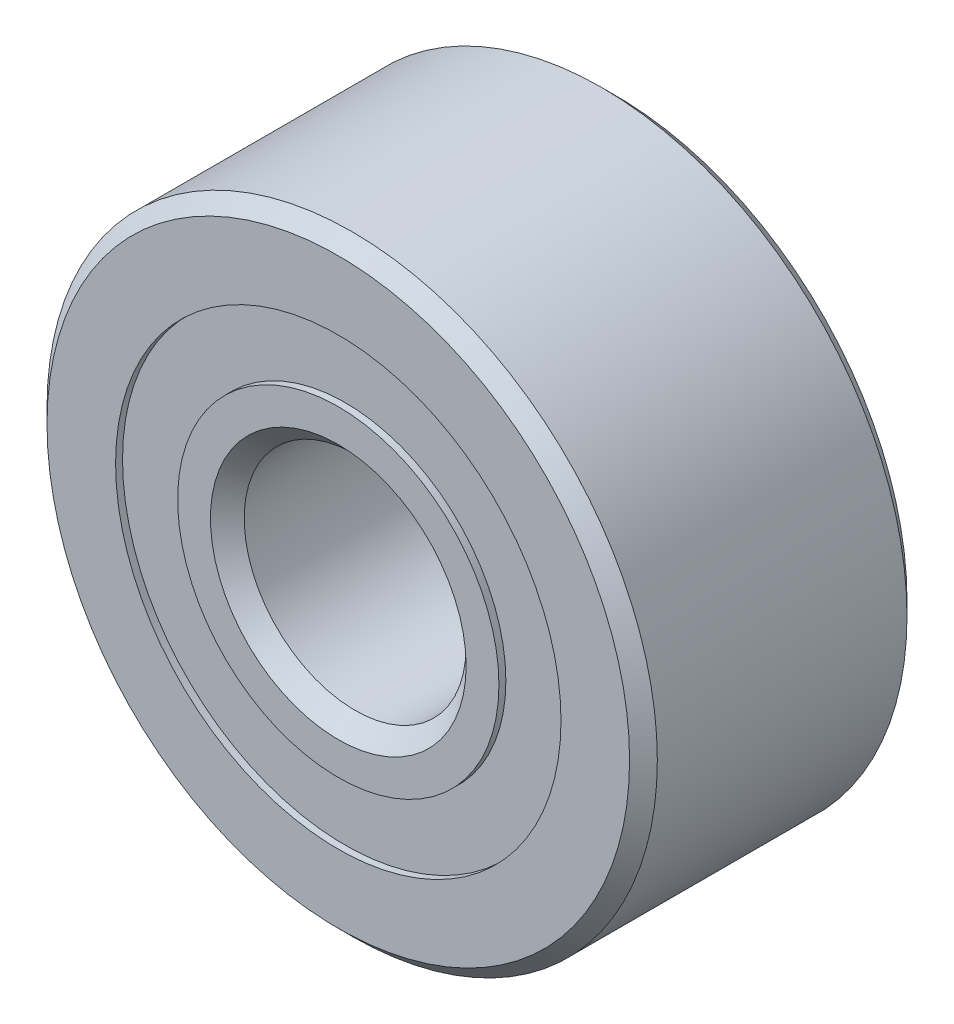
ISO-10303-21;
HEADER;
FILE_DESCRIPTION(('STEP AP214'),'2;1');
FILE_NAME('part.step','',(''),(''),'','','');
FILE_SCHEMA(('AUTOMOTIVE_DESIGN { 1 0 10303 214 1 1 1 1 }'));
ENDSEC;
DATA;
#1=APPLICATION_CONTEXT('core data for automotive mechanical design processes');
#2=APPLICATION_PROTOCOL_DEFINITION('international standard','automotive_design',2000,#1);
#3=PRODUCT_CONTEXT('',#1,'mechanical');
#4=PRODUCT('Part','Part','',(#3));
#5=PRODUCT_RELATED_PRODUCT_CATEGORY('part','',(#4));
#6=PRODUCT_DEFINITION_FORMATION('','',#4);
#7=PRODUCT_DEFINITION_CONTEXT('part definition',#1,'design');
#8=PRODUCT_DEFINITION('design','',#6,#7);
#9=PRODUCT_DEFINITION_SHAPE('','',#8);
#10=(LENGTH_UNIT() NAMED_UNIT(*) SI_UNIT(.MILLI.,.METRE.));
#11=(NAMED_UNIT(*) PLANE_ANGLE_UNIT() SI_UNIT($,.RADIAN.));
#12=(NAMED_UNIT(*) SI_UNIT($,.STERADIAN.) SOLID_ANGLE_UNIT());
#13=UNCERTAINTY_MEASURE_WITH_UNIT(LENGTH_MEASURE(1.E-05),#10,'distance_accuracy_value','');
#14=(GEOMETRIC_REPRESENTATION_CONTEXT(3) GLOBAL_UNCERTAINTY_ASSIGNED_CONTEXT((#13)) GLOBAL_UNIT_ASSIGNED_CONTEXT((#10,
#11,#12)) REPRESENTATION_CONTEXT('',''));
#15=CARTESIAN_POINT('',(0.,0.,0.));
#16=DIRECTION('',(0.,0.,1.));
#17=DIRECTION('',(1.,0.,0.));
#18=AXIS2_PLACEMENT_3D('',#15,#16,#17);
#19=CARTESIAN_POINT('',(0.,6.37180631868132,-3.7703125));
#20=DIRECTION('',(0.,0.,1.));
#21=DIRECTION('',(1.,0.,0.));
#22=AXIS2_PLACEMENT_3D('',#19,#20,#21);
#23=PLANE('',#22);
#24=CARTESIAN_POINT('',(0.,0.,-3.7703125));
#25=DIRECTION('',(0.,0.,1.));
#26=DIRECTION('',(1.,0.,0.));
#27=AXIS2_PLACEMENT_3D('',#24,#25,#26);
#28=CIRCLE('',#27,6.37180631868132);
#29=CARTESIAN_POINT('',(6.37180631868132,0.,-3.7703125));
#30=VERTEX_POINT('',#29);
#31=EDGE_CURVE('E64',#30,#30,#28,.T.);
#32=ORIENTED_EDGE('',*,*,#31,.F.);
#33=EDGE_LOOP('',(#32));
#34=FACE_BOUND('',#33,.T.);
#35=CARTESIAN_POINT('',(0.,0.,-3.7703125));
#36=DIRECTION('',(0.,0.,1.));
#37=DIRECTION('',(1.,0.,0.));
#38=AXIS2_PLACEMENT_3D('',#35,#36,#37);
#39=CIRCLE('',#38,4.59602866646654);
#40=CARTESIAN_POINT('',(4.59602866646654,0.,-3.7703125));
#41=VERTEX_POINT('',#40);
#42=EDGE_CURVE('E11',#41,#41,#39,.T.);
#43=ORIENTED_EDGE('',*,*,#42,.T.);
#44=EDGE_LOOP('',(#43));
#45=FACE_BOUND('',#44,.T.);
#46=ADVANCED_FACE('F50',(#34,#45),#23,.F.);
#47=CARTESIAN_POINT('',(0.,0.,3.96875));
#48=DIRECTION('',(0.,0.,1.));
#49=DIRECTION('',(1.,0.,0.));
#50=AXIS2_PLACEMENT_3D('',#47,#48,#49);
#51=CYLINDRICAL_SURFACE('',#50,4.59602866646654);
#52=ORIENTED_EDGE('',*,*,#42,.F.);
#53=EDGE_LOOP('',(#52));
#54=FACE_BOUND('',#53,.T.);
#55=CARTESIAN_POINT('',(0.,0.,-1.81289769677122));
#56=DIRECTION('',(0.,0.,1.));
#57=DIRECTION('',(1.,0.,0.));
#58=AXIS2_PLACEMENT_3D('',#55,#56,#57);
#59=CIRCLE('',#58,4.59602866646654);
#60=CARTESIAN_POINT('',(4.59602866646654,0.,-1.81289769677122));
#61=VERTEX_POINT('',#60);
#62=EDGE_CURVE('E56',#61,#61,#59,.T.);
#63=ORIENTED_EDGE('',*,*,#62,.T.);
#64=EDGE_LOOP('',(#63));
#65=FACE_BOUND('',#64,.T.);
#66=ADVANCED_FACE('F73',(#54,#65),#51,.F.);
#67=CARTESIAN_POINT('',(0.,6.37180631868132,-1.81289769677122));
#68=DIRECTION('',(0.,0.,-1.));
#69=DIRECTION('',(-1.,0.,0.));
#70=AXIS2_PLACEMENT_3D('',#67,#68,#69);
#71=PLANE('',#70);
#72=ORIENTED_EDGE('',*,*,#62,.F.);
#73=EDGE_LOOP('',(#72));
#74=FACE_BOUND('',#73,.T.);
#75=CARTESIAN_POINT('',(0.,0.,-1.81289769677122));
#76=DIRECTION('',(0.,0.,1.));
#77=DIRECTION('',(1.,0.,0.));
#78=AXIS2_PLACEMENT_3D('',#75,#76,#77);
#79=CIRCLE('',#78,6.37180631868132);
#80=CARTESIAN_POINT('',(6.37180631868132,0.,-1.81289769677122));
#81=VERTEX_POINT('',#80);
#82=EDGE_CURVE('E60',#81,#81,#79,.T.);
#83=ORIENTED_EDGE('',*,*,#82,.T.);
#84=EDGE_LOOP('',(#83));
#85=FACE_BOUND('',#84,.T.);
#86=ADVANCED_FACE('F77',(#74,#85),#71,.F.);
#87=CARTESIAN_POINT('',(0.,0.,3.96875));
#88=DIRECTION('',(0.,0.,1.));
#89=DIRECTION('',(1.,0.,0.));
#90=AXIS2_PLACEMENT_3D('',#87,#88,#89);
#91=CYLINDRICAL_SURFACE('',#90,6.37180631868132);
#92=ORIENTED_EDGE('',*,*,#82,.F.);
#93=EDGE_LOOP('',(#92));
#94=FACE_BOUND('',#93,.T.);
#95=ORIENTED_EDGE('',*,*,#31,.T.);
#96=EDGE_LOOP('',(#95));
#97=FACE_BOUND('',#96,.T.);
#98=ADVANCED_FACE('F70',(#94,#97),#91,.T.);
#99=CLOSED_SHELL('',(#46,#66,#86,#98));
#100=MANIFOLD_SOLID_BREP('B2',#99);
#101=CARTESIAN_POINT('',(0.,6.37180631868132,3.7703125));
#102=DIRECTION('',(0.,0.,-1.));
#103=DIRECTION('',(-1.,0.,0.));
#104=AXIS2_PLACEMENT_3D('',#101,#102,#103);
#105=PLANE('',#104);
#106=CARTESIAN_POINT('',(0.,0.,3.7703125));
#107=DIRECTION('',(0.,0.,1.));
#108=DIRECTION('',(1.,0.,0.));
#109=AXIS2_PLACEMENT_3D('',#106,#107,#108);
#110=CIRCLE('',#109,4.59602866646654);
#111=CARTESIAN_POINT('',(4.59602866646654,0.,3.7703125));
#112=VERTEX_POINT('',#111);
#113=EDGE_CURVE('E49',#112,#112,#110,.T.);
#114=ORIENTED_EDGE('',*,*,#113,.F.);
#115=EDGE_LOOP('',(#114));
#116=FACE_BOUND('',#115,.T.);
#117=CARTESIAN_POINT('',(0.,0.,3.7703125));
#118=DIRECTION('',(0.,0.,1.));
#119=DIRECTION('',(1.,0.,0.));
#120=AXIS2_PLACEMENT_3D('',#117,#118,#119);
#121=CIRCLE('',#120,6.37180631868132);
#122=CARTESIAN_POINT('',(6.37180631868132,0.,3.7703125));
#123=VERTEX_POINT('',#122);
#124=EDGE_CURVE('E124',#123,#123,#121,.T.);
#125=ORIENTED_EDGE('',*,*,#124,.T.);
#126=EDGE_LOOP('',(#125));
#127=FACE_BOUND('',#126,.T.);
#128=ADVANCED_FACE('F110',(#116,#127),#105,.F.);
#129=CARTESIAN_POINT('',(0.,0.,3.96875));
#130=DIRECTION('',(0.,0.,1.));
#131=DIRECTION('',(1.,0.,0.));
#132=AXIS2_PLACEMENT_3D('',#129,#130,#131);
#133=CYLINDRICAL_SURFACE('',#132,4.59602866646654);
#134=CARTESIAN_POINT('',(0.,0.,1.81289769677122));
#135=DIRECTION('',(0.,0.,1.));
#136=DIRECTION('',(1.,0.,0.));
#137=AXIS2_PLACEMENT_3D('',#134,#135,#136);
#138=CIRCLE('',#137,4.59602866646654);
#139=CARTESIAN_POINT('',(4.59602866646654,0.,1.81289769677122));
#140=VERTEX_POINT('',#139);
#141=EDGE_CURVE('E116',#140,#140,#138,.T.);
#142=ORIENTED_EDGE('',*,*,#141,.F.);
#143=EDGE_LOOP('',(#142));
#144=FACE_BOUND('',#143,.T.);
#145=ORIENTED_EDGE('',*,*,#113,.T.);
#146=EDGE_LOOP('',(#145));
#147=FACE_BOUND('',#146,.T.);
#148=ADVANCED_FACE('F139',(#144,#147),#133,.F.);
#149=CARTESIAN_POINT('',(0.,6.37180631868132,1.81289769677122));
#150=DIRECTION('',(0.,0.,1.));
#151=DIRECTION('',(1.,0.,0.));
#152=AXIS2_PLACEMENT_3D('',#149,#150,#151);
#153=PLANE('',#152);
#154=CARTESIAN_POINT('',(0.,0.,1.81289769677122));
#155=DIRECTION('',(0.,0.,1.));
#156=DIRECTION('',(1.,0.,0.));
#157=AXIS2_PLACEMENT_3D('',#154,#155,#156);
#158=CIRCLE('',#157,6.37180631868132);
#159=CARTESIAN_POINT('',(6.37180631868132,0.,1.81289769677122));
#160=VERTEX_POINT('',#159);
#161=EDGE_CURVE('E120',#160,#160,#158,.T.);
#162=ORIENTED_EDGE('',*,*,#161,.F.);
#163=EDGE_LOOP('',(#162));
#164=FACE_BOUND('',#163,.T.);
#165=ORIENTED_EDGE('',*,*,#141,.T.);
#166=EDGE_LOOP('',(#165));
#167=FACE_BOUND('',#166,.T.);
#168=ADVANCED_FACE('F134',(#164,#167),#153,.F.);
#169=CARTESIAN_POINT('',(0.,0.,3.96875));
#170=DIRECTION('',(0.,0.,1.));
#171=DIRECTION('',(1.,0.,0.));
#172=AXIS2_PLACEMENT_3D('',#169,#170,#171);
#173=CYLINDRICAL_SURFACE('',#172,6.37180631868132);
#174=ORIENTED_EDGE('',*,*,#124,.F.);
#175=EDGE_LOOP('',(#174));
#176=FACE_BOUND('',#175,.T.);
#177=ORIENTED_EDGE('',*,*,#161,.T.);
#178=EDGE_LOOP('',(#177));
#179=FACE_BOUND('',#178,.T.);
#180=ADVANCED_FACE('F131',(#176,#179),#173,.T.);
#181=CLOSED_SHELL('',(#128,#148,#168,#180));
#182=MANIFOLD_SOLID_BREP('B6',#181);
#183=CARTESIAN_POINT('',(-4.20949505675111,4.20949505675122,0.));
#184=DIRECTION('',(0.,0.,1.));
#185=DIRECTION('',(-0.707106781186539,0.707106781186556,0.));
#186=AXIS2_PLACEMENT_3D('',#183,#184,#185);
#187=SPHERICAL_SURFACE('',#186,1.81289769677122);
#188=CARTESIAN_POINT('',(-4.20949505675111,4.20949505675122,1.81289769677122));
#189=VERTEX_POINT('',#188);
#190=VERTEX_LOOP('',#189);
#191=FACE_BOUND('',#190,.T.);
#192=ADVANCED_FACE('F192',(#191),#187,.T.);
#193=CLOSED_SHELL('',(#192));
#194=MANIFOLD_SOLID_BREP('B44',#193);
#195=CARTESIAN_POINT('',(-5.953125,0.,0.));
#196=DIRECTION('',(0.,0.,1.));
#197=DIRECTION('',(-1.,0.,0.));
#198=AXIS2_PLACEMENT_3D('',#195,#196,#197);
#199=SPHERICAL_SURFACE('',#198,1.81289769677122);
#200=CARTESIAN_POINT('',(-5.953125,0.,1.81289769677122));
#201=VERTEX_POINT('',#200);
#202=VERTEX_LOOP('',#201);
#203=FACE_BOUND('',#202,.T.);
#204=ADVANCED_FACE('F227',(#203),#199,.T.);
#205=CLOSED_SHELL('',(#204));
#206=MANIFOLD_SOLID_BREP('B106',#205);
#207=CARTESIAN_POINT('',(-4.2094950567512,-4.20949505675113,0.));
#208=DIRECTION('',(0.,0.,1.));
#209=DIRECTION('',(-0.707106781186554,-0.707106781186541,0.));
#210=AXIS2_PLACEMENT_3D('',#207,#208,#209);
#211=SPHERICAL_SURFACE('',#210,1.81289769677122);
#212=CARTESIAN_POINT('',(-4.2094950567512,-4.20949505675113,1.81289769677122));
#213=VERTEX_POINT('',#212);
#214=VERTEX_LOOP('',#213);
#215=FACE_BOUND('',#214,.T.);
#216=ADVANCED_FACE('F262',(#215),#211,.T.);
#217=CLOSED_SHELL('',(#216));
#218=MANIFOLD_SOLID_BREP('B188',#217);
#219=CARTESIAN_POINT('',(0.,-5.953125,0.));
#220=DIRECTION('',(0.,0.,1.));
#221=DIRECTION('',(0.,-1.,0.));
#222=AXIS2_PLACEMENT_3D('',#219,#220,#221);
#223=SPHERICAL_SURFACE('',#222,1.81289769677122);
#224=CARTESIAN_POINT('',(0.,-5.953125,1.81289769677122));
#225=VERTEX_POINT('',#224);
#226=VERTEX_LOOP('',#225);
#227=FACE_BOUND('',#226,.T.);
#228=ADVANCED_FACE('F297',(#227),#223,.T.);
#229=CLOSED_SHELL('',(#228));
#230=MANIFOLD_SOLID_BREP('B223',#229);
#231=CARTESIAN_POINT('',(4.20949505675114,-4.20949505675119,0.));
#232=DIRECTION('',(0.,0.,1.));
#233=DIRECTION('',(0.707106781186544,-0.707106781186551,0.));
#234=AXIS2_PLACEMENT_3D('',#231,#232,#233);
#235=SPHERICAL_SURFACE('',#234,1.81289769677122);
#236=CARTESIAN_POINT('',(4.20949505675114,-4.20949505675119,1.81289769677122));
#237=VERTEX_POINT('',#236);
#238=VERTEX_LOOP('',#237);
#239=FACE_BOUND('',#238,.T.);
#240=ADVANCED_FACE('F332',(#239),#235,.T.);
#241=CLOSED_SHELL('',(#240));
#242=MANIFOLD_SOLID_BREP('B258',#241);
#243=CARTESIAN_POINT('',(5.953125,0.,0.));
#244=DIRECTION('',(0.,0.,1.));
#245=DIRECTION('',(1.,0.,0.));
#246=AXIS2_PLACEMENT_3D('',#243,#244,#245);
#247=SPHERICAL_SURFACE('',#246,1.81289769677122);
#248=CARTESIAN_POINT('',(5.953125,0.,1.81289769677122));
#249=VERTEX_POINT('',#248);
#250=VERTEX_LOOP('',#249);
#251=FACE_BOUND('',#250,.T.);
#252=ADVANCED_FACE('F367',(#251),#247,.T.);
#253=CLOSED_SHELL('',(#252));
#254=MANIFOLD_SOLID_BREP('B293',#253);
#255=CARTESIAN_POINT('',(4.20949505675117,4.20949505675116,0.));
#256=DIRECTION('',(0.,0.,1.));
#257=DIRECTION('',(0.707106781186549,0.707106781186546,0.));
#258=AXIS2_PLACEMENT_3D('',#255,#256,#257);
#259=SPHERICAL_SURFACE('',#258,1.81289769677122);
#260=CARTESIAN_POINT('',(4.20949505675117,4.20949505675116,1.81289769677122));
#261=VERTEX_POINT('',#260);
#262=VERTEX_LOOP('',#261);
#263=FACE_BOUND('',#262,.T.);
#264=ADVANCED_FACE('F402',(#263),#259,.T.);
#265=CLOSED_SHELL('',(#264));
#266=MANIFOLD_SOLID_BREP('B328',#265);
#267=CARTESIAN_POINT('',(0.,5.953125,0.));
#268=DIRECTION('',(0.,0.,1.));
#269=DIRECTION('',(0.,1.,0.));
#270=AXIS2_PLACEMENT_3D('',#267,#268,#269);
#271=SPHERICAL_SURFACE('',#270,1.81289769677122);
#272=CARTESIAN_POINT('',(0.,5.953125,1.81289769677122));
#273=VERTEX_POINT('',#272);
#274=VERTEX_LOOP('',#273);
#275=FACE_BOUND('',#274,.T.);
#276=ADVANCED_FACE('F439',(#275),#271,.T.);
#277=CLOSED_SHELL('',(#276));
#278=MANIFOLD_SOLID_BREP('B363',#277);
#279=CARTESIAN_POINT('',(0.,0.,3.96875));
#280=DIRECTION('',(0.,0.,1.));
#281=DIRECTION('',(1.,0.,0.));
#282=AXIS2_PLACEMENT_3D('',#279,#280,#281);
#283=CYLINDRICAL_SURFACE('',#282,4.59602866646654);
#284=CARTESIAN_POINT('',(0.,0.,3.96875));
#285=DIRECTION('',(0.,0.,1.));
#286=DIRECTION('',(1.,0.,0.));
#287=AXIS2_PLACEMENT_3D('',#284,#285,#286);
#288=CIRCLE('',#287,4.59602866646654);
#289=CARTESIAN_POINT('',(4.59602866646654,0.,3.96875));
#290=VERTEX_POINT('',#289);
#291=EDGE_CURVE('E497',#290,#290,#288,.T.);
#292=ORIENTED_EDGE('',*,*,#291,.F.);
#293=EDGE_LOOP('',(#292));
#294=FACE_BOUND('',#293,.T.);
#295=CARTESIAN_POINT('',(0.,0.,3.7703125));
#296=DIRECTION('',(0.,0.,1.));
#297=DIRECTION('',(1.,0.,0.));
#298=AXIS2_PLACEMENT_3D('',#295,#296,#297);
#299=CIRCLE('',#298,4.59602866646654);
#300=CARTESIAN_POINT('',(4.59602866646654,0.,3.7703125));
#301=VERTEX_POINT('',#300);
#302=EDGE_CURVE('E438',#301,#301,#299,.T.);
#303=ORIENTED_EDGE('',*,*,#302,.T.);
#304=EDGE_LOOP('',(#303));
#305=FACE_BOUND('',#304,.T.);
#306=ADVANCED_FACE('F457',(#294,#305),#283,.T.);
#307=CARTESIAN_POINT('',(0.,4.59602866646654,3.7703125));
#308=DIRECTION('',(0.,0.,1.));
#309=DIRECTION('',(1.,0.,0.));
#310=AXIS2_PLACEMENT_3D('',#307,#308,#309);
#311=PLANE('',#310);
#312=ORIENTED_EDGE('',*,*,#302,.F.);
#313=EDGE_LOOP('',(#312));
#314=FACE_BOUND('',#313,.T.);
#315=CARTESIAN_POINT('',(0.,0.,3.7703125));
#316=DIRECTION('',(0.,0.,1.));
#317=DIRECTION('',(1.,0.,0.));
#318=AXIS2_PLACEMENT_3D('',#315,#316,#317);
#319=CIRCLE('',#318,4.39759116646653);
#320=CARTESIAN_POINT('',(4.39759116646653,0.,3.7703125));
#321=VERTEX_POINT('',#320);
#322=EDGE_CURVE('E463',#321,#321,#319,.T.);
#323=ORIENTED_EDGE('',*,*,#322,.T.);
#324=EDGE_LOOP('',(#323));
#325=FACE_BOUND('',#324,.T.);
#326=ADVANCED_FACE('F504',(#314,#325),#311,.F.);
#327=CARTESIAN_POINT('',(0.,0.,3.03033498514786));
#328=DIRECTION('',(0.,0.,1.));
#329=DIRECTION('',(1.,0.,0.));
#330=AXIS2_PLACEMENT_3D('',#327,#328,#329);
#331=CONICAL_SURFACE('',#330,3.65761365161439,0.78539816339745);
#332=ORIENTED_EDGE('',*,*,#322,.F.);
#333=EDGE_LOOP('',(#332));
#334=FACE_BOUND('',#333,.T.);
#335=CARTESIAN_POINT('',(0.,0.,3.03033498514786));
#336=DIRECTION('',(0.,0.,1.));
#337=DIRECTION('',(1.,0.,0.));
#338=AXIS2_PLACEMENT_3D('',#335,#336,#337);
#339=CIRCLE('',#338,3.65761365161439);
#340=CARTESIAN_POINT('',(3.65761365161439,0.,3.03033498514786));
#341=VERTEX_POINT('',#340);
#342=EDGE_CURVE('E467',#341,#341,#339,.T.);
#343=ORIENTED_EDGE('',*,*,#342,.T.);
#344=EDGE_LOOP('',(#343));
#345=FACE_BOUND('',#344,.T.);
#346=ADVANCED_FACE('F508',(#334,#345),#331,.T.);
#347=CARTESIAN_POINT('',(0.,0.,3.96875));
#348=DIRECTION('',(0.,0.,1.));
#349=DIRECTION('',(1.,0.,0.));
#350=AXIS2_PLACEMENT_3D('',#347,#348,#349);
#351=CYLINDRICAL_SURFACE('',#350,3.65761365161439);
#352=ORIENTED_EDGE('',*,*,#342,.F.);
#353=EDGE_LOOP('',(#352));
#354=FACE_BOUND('',#353,.T.);
#355=CARTESIAN_POINT('',(0.,0.,0.));
#356=DIRECTION('',(0.,0.,1.));
#357=DIRECTION('',(1.,0.,0.));
#358=AXIS2_PLACEMENT_3D('',#355,#356,#357);
#359=CIRCLE('',#358,3.65761365161439);
#360=CARTESIAN_POINT('',(3.65761365161439,0.,0.));
#361=VERTEX_POINT('',#360);
#362=EDGE_CURVE('E471',#361,#361,#359,.T.);
#363=ORIENTED_EDGE('',*,*,#362,.T.);
#364=EDGE_LOOP('',(#363));
#365=FACE_BOUND('',#364,.T.);
#366=ADVANCED_FACE('F513',(#354,#365),#351,.T.);
#367=CARTESIAN_POINT('',(0.,3.65761365161439,0.));
#368=DIRECTION('',(0.,0.,-1.));
#369=DIRECTION('',(-1.,0.,0.));
#370=AXIS2_PLACEMENT_3D('',#367,#368,#369);
#371=PLANE('',#370);
#372=ORIENTED_EDGE('',*,*,#362,.F.);
#373=EDGE_LOOP('',(#372));
#374=FACE_BOUND('',#373,.T.);
#375=CARTESIAN_POINT('',(0.,0.,0.));
#376=DIRECTION('',(0.,0.,1.));
#377=DIRECTION('',(1.,0.,0.));
#378=AXIS2_PLACEMENT_3D('',#375,#376,#377);
#379=CIRCLE('',#378,4.14022730322878);
#380=CARTESIAN_POINT('',(4.14022730322878,0.,0.));
#381=VERTEX_POINT('',#380);
#382=EDGE_CURVE('E476',#381,#381,#379,.T.);
#383=ORIENTED_EDGE('',*,*,#382,.T.);
#384=EDGE_LOOP('',(#383));
#385=FACE_BOUND('',#384,.T.);
#386=ADVANCED_FACE('F519',(#374,#385),#371,.F.);
#387=CARTESIAN_POINT('',(0.,0.,0.));
#388=DIRECTION('',(0.,0.,1.));
#389=DIRECTION('',(1.,0.,0.));
#390=AXIS2_PLACEMENT_3D('',#387,#388,#389);
#391=TOROIDAL_SURFACE('',#390,5.953125,1.81289769677122);
#392=ORIENTED_EDGE('',*,*,#382,.F.);
#393=EDGE_LOOP('',(#392));
#394=FACE_BOUND('',#393,.T.);
#395=CARTESIAN_POINT('',(0.,0.,-1.76388888888889));
#396=DIRECTION('',(0.,0.,1.));
#397=DIRECTION('',(1.,0.,0.));
#398=AXIS2_PLACEMENT_3D('',#395,#396,#397);
#399=CIRCLE('',#398,5.53444368131868);
#400=CARTESIAN_POINT('',(5.53444368131868,0.,-1.76388888888889));
#401=VERTEX_POINT('',#400);
#402=EDGE_CURVE('E479',#401,#401,#399,.T.);
#403=ORIENTED_EDGE('',*,*,#402,.T.);
#404=EDGE_LOOP('',(#403));
#405=FACE_BOUND('',#404,.T.);
#406=ADVANCED_FACE('F523',(#394,#405),#391,.F.);
#407=CARTESIAN_POINT('',(0.,0.,3.96875));
#408=DIRECTION('',(0.,0.,1.));
#409=DIRECTION('',(1.,0.,0.));
#410=AXIS2_PLACEMENT_3D('',#407,#408,#409);
#411=CYLINDRICAL_SURFACE('',#410,5.53444368131868);
#412=ORIENTED_EDGE('',*,*,#402,.F.);
#413=EDGE_LOOP('',(#412));
#414=FACE_BOUND('',#413,.T.);
#415=CARTESIAN_POINT('',(0.,0.,-3.96875));
#416=DIRECTION('',(0.,0.,1.));
#417=DIRECTION('',(1.,0.,0.));
#418=AXIS2_PLACEMENT_3D('',#415,#416,#417);
#419=CIRCLE('',#418,5.53444368131868);
#420=CARTESIAN_POINT('',(5.53444368131868,0.,-3.96875));
#421=VERTEX_POINT('',#420);
#422=EDGE_CURVE('E482',#421,#421,#419,.T.);
#423=ORIENTED_EDGE('',*,*,#422,.T.);
#424=EDGE_LOOP('',(#423));
#425=FACE_BOUND('',#424,.T.);
#426=ADVANCED_FACE('F527',(#414,#425),#411,.T.);
#427=CARTESIAN_POINT('',(0.,3.571875,-3.96875));
#428=DIRECTION('',(0.,0.,1.));
#429=DIRECTION('',(1.,0.,0.));
#430=AXIS2_PLACEMENT_3D('',#427,#428,#429);
#431=PLANE('',#430);
#432=ORIENTED_EDGE('',*,*,#422,.F.);
#433=EDGE_LOOP('',(#432));
#434=FACE_BOUND('',#433,.T.);
#435=CARTESIAN_POINT('',(0.,0.,-3.96875));
#436=DIRECTION('',(0.,0.,1.));
#437=DIRECTION('',(1.,0.,0.));
#438=AXIS2_PLACEMENT_3D('',#435,#436,#437);
#439=CIRCLE('',#438,3.571875);
#440=CARTESIAN_POINT('',(3.571875,0.,-3.96875));
#441=VERTEX_POINT('',#440);
#442=EDGE_CURVE('E485',#441,#441,#439,.T.);
#443=ORIENTED_EDGE('',*,*,#442,.T.);
#444=EDGE_LOOP('',(#443));
#445=FACE_BOUND('',#444,.T.);
#446=ADVANCED_FACE('F531',(#434,#445),#431,.F.);
#447=CARTESIAN_POINT('',(0.,0.,-3.571875));
#448=DIRECTION('',(0.,0.,-1.));
#449=DIRECTION('',(-1.,0.,0.));
#450=AXIS2_PLACEMENT_3D('',#447,#448,#449);
#451=CONICAL_SURFACE('',#450,3.175,0.785398163397446);
#452=ORIENTED_EDGE('',*,*,#442,.F.);
#453=EDGE_LOOP('',(#452));
#454=FACE_BOUND('',#453,.T.);
#455=CARTESIAN_POINT('',(0.,0.,-3.571875));
#456=DIRECTION('',(0.,0.,1.));
#457=DIRECTION('',(1.,0.,0.));
#458=AXIS2_PLACEMENT_3D('',#455,#456,#457);
#459=CIRCLE('',#458,3.175);
#460=CARTESIAN_POINT('',(3.175,0.,-3.571875));
#461=VERTEX_POINT('',#460);
#462=EDGE_CURVE('E488',#461,#461,#459,.T.);
#463=ORIENTED_EDGE('',*,*,#462,.T.);
#464=EDGE_LOOP('',(#463));
#465=FACE_BOUND('',#464,.T.);
#466=ADVANCED_FACE('F535',(#454,#465),#451,.F.);
#467=CARTESIAN_POINT('',(0.,0.,3.96875));
#468=DIRECTION('',(0.,0.,1.));
#469=DIRECTION('',(1.,0.,0.));
#470=AXIS2_PLACEMENT_3D('',#467,#468,#469);
#471=CYLINDRICAL_SURFACE('',#470,3.175);
#472=ORIENTED_EDGE('',*,*,#462,.F.);
#473=EDGE_LOOP('',(#472));
#474=FACE_BOUND('',#473,.T.);
#475=CARTESIAN_POINT('',(0.,0.,3.48613634838561));
#476=DIRECTION('',(0.,0.,1.));
#477=DIRECTION('',(1.,0.,0.));
#478=AXIS2_PLACEMENT_3D('',#475,#476,#477);
#479=CIRCLE('',#478,3.175);
#480=CARTESIAN_POINT('',(3.175,0.,3.48613634838561));
#481=VERTEX_POINT('',#480);
#482=EDGE_CURVE('E491',#481,#481,#479,.T.);
#483=ORIENTED_EDGE('',*,*,#482,.T.);
#484=EDGE_LOOP('',(#483));
#485=FACE_BOUND('',#484,.T.);
#486=ADVANCED_FACE('F539',(#474,#485),#471,.F.);
#487=CARTESIAN_POINT('',(0.,0.,3.96875));
#488=DIRECTION('',(0.,0.,1.));
#489=DIRECTION('',(1.,0.,0.));
#490=AXIS2_PLACEMENT_3D('',#487,#488,#489);
#491=CONICAL_SURFACE('',#490,3.65761365161439,0.78539816339745);
#492=ORIENTED_EDGE('',*,*,#482,.F.);
#493=EDGE_LOOP('',(#492));
#494=FACE_BOUND('',#493,.T.);
#495=CARTESIAN_POINT('',(0.,0.,3.96875));
#496=DIRECTION('',(0.,0.,1.));
#497=DIRECTION('',(1.,0.,0.));
#498=AXIS2_PLACEMENT_3D('',#495,#496,#497);
#499=CIRCLE('',#498,3.65761365161439);
#500=CARTESIAN_POINT('',(3.65761365161439,0.,3.96875));
#501=VERTEX_POINT('',#500);
#502=EDGE_CURVE('E494',#501,#501,#499,.T.);
#503=ORIENTED_EDGE('',*,*,#502,.T.);
#504=EDGE_LOOP('',(#503));
#505=FACE_BOUND('',#504,.T.);
#506=ADVANCED_FACE('F543',(#494,#505),#491,.F.);
#507=CARTESIAN_POINT('',(0.,4.59602866646654,3.96875));
#508=DIRECTION('',(0.,0.,-1.));
#509=DIRECTION('',(-1.,0.,0.));
#510=AXIS2_PLACEMENT_3D('',#507,#508,#509);
#511=PLANE('',#510);
#512=ORIENTED_EDGE('',*,*,#502,.F.);
#513=EDGE_LOOP('',(#512));
#514=FACE_BOUND('',#513,.T.);
#515=ORIENTED_EDGE('',*,*,#291,.T.);
#516=EDGE_LOOP('',(#515));
#517=FACE_BOUND('',#516,.T.);
#518=ADVANCED_FACE('F501',(#514,#517),#511,.F.);
#519=CLOSED_SHELL('',(#306,#326,#346,#366,#386,#406,#426,#446,#466,#486,#506,#518));
#520=MANIFOLD_SOLID_BREP('B398',#519);
#521=CARTESIAN_POINT('',(0.,0.,3.571875));
#522=DIRECTION('',(0.,0.,-1.));
#523=DIRECTION('',(-1.,0.,0.));
#524=AXIS2_PLACEMENT_3D('',#521,#522,#523);
#525=CONICAL_SURFACE('',#524,8.73125,0.785398163397447);
#526=CARTESIAN_POINT('',(0.,0.,3.96875));
#527=DIRECTION('',(0.,0.,1.));
#528=DIRECTION('',(1.,0.,0.));
#529=AXIS2_PLACEMENT_3D('',#526,#527,#528);
#530=CIRCLE('',#529,8.334375);
#531=CARTESIAN_POINT('',(8.334375,0.,3.96875));
#532=VERTEX_POINT('',#531);
#533=EDGE_CURVE('E643',#532,#532,#530,.T.);
#534=ORIENTED_EDGE('',*,*,#533,.F.);
#535=EDGE_LOOP('',(#534));
#536=FACE_BOUND('',#535,.T.);
#537=CARTESIAN_POINT('',(0.,0.,3.571875));
#538=DIRECTION('',(0.,0.,1.));
#539=DIRECTION('',(1.,0.,0.));
#540=AXIS2_PLACEMENT_3D('',#537,#538,#539);
#541=CIRCLE('',#540,8.73125);
#542=CARTESIAN_POINT('',(8.73125,0.,3.571875));
#543=VERTEX_POINT('',#542);
#544=EDGE_CURVE('E456',#543,#543,#541,.T.);
#545=ORIENTED_EDGE('',*,*,#544,.T.);
#546=EDGE_LOOP('',(#545));
#547=FACE_BOUND('',#546,.T.);
#548=ADVANCED_FACE('F615',(#536,#547),#525,.T.);
#549=CARTESIAN_POINT('',(0.,0.,3.96875));
#550=DIRECTION('',(0.,0.,1.));
#551=DIRECTION('',(1.,0.,0.));
#552=AXIS2_PLACEMENT_3D('',#549,#550,#551);
#553=CYLINDRICAL_SURFACE('',#552,8.73125);
#554=ORIENTED_EDGE('',*,*,#544,.F.);
#555=EDGE_LOOP('',(#554));
#556=FACE_BOUND('',#555,.T.);
#557=CARTESIAN_POINT('',(0.,0.,-3.571875));
#558=DIRECTION('',(0.,0.,1.));
#559=DIRECTION('',(1.,0.,0.));
#560=AXIS2_PLACEMENT_3D('',#557,#558,#559);
#561=CIRCLE('',#560,8.73125);
#562=CARTESIAN_POINT('',(8.73125,0.,-3.571875));
#563=VERTEX_POINT('',#562);
#564=EDGE_CURVE('E621',#563,#563,#561,.T.);
#565=ORIENTED_EDGE('',*,*,#564,.T.);
#566=EDGE_LOOP('',(#565));
#567=FACE_BOUND('',#566,.T.);
#568=ADVANCED_FACE('F650',(#556,#567),#553,.T.);
#569=CARTESIAN_POINT('',(0.,0.,-3.96875));
#570=DIRECTION('',(0.,0.,1.));
#571=DIRECTION('',(1.,0.,0.));
#572=AXIS2_PLACEMENT_3D('',#569,#570,#571);
#573=CONICAL_SURFACE('',#572,8.334375,0.785398163397448);
#574=ORIENTED_EDGE('',*,*,#564,.F.);
#575=EDGE_LOOP('',(#574));
#576=FACE_BOUND('',#575,.T.);
#577=CARTESIAN_POINT('',(0.,0.,-3.96875));
#578=DIRECTION('',(0.,0.,1.));
#579=DIRECTION('',(1.,0.,0.));
#580=AXIS2_PLACEMENT_3D('',#577,#578,#579);
#581=CIRCLE('',#580,8.334375);
#582=CARTESIAN_POINT('',(8.334375,0.,-3.96875));
#583=VERTEX_POINT('',#582);
#584=EDGE_CURVE('E625',#583,#583,#581,.T.);
#585=ORIENTED_EDGE('',*,*,#584,.T.);
#586=EDGE_LOOP('',(#585));
#587=FACE_BOUND('',#586,.T.);
#588=ADVANCED_FACE('F654',(#576,#587),#573,.T.);
#589=CARTESIAN_POINT('',(0.,8.334375,-3.96875));
#590=DIRECTION('',(0.,0.,1.));
#591=DIRECTION('',(1.,0.,0.));
#592=AXIS2_PLACEMENT_3D('',#589,#590,#591);
#593=PLANE('',#592);
#594=ORIENTED_EDGE('',*,*,#584,.F.);
#595=EDGE_LOOP('',(#594));
#596=FACE_BOUND('',#595,.T.);
#597=CARTESIAN_POINT('',(0.,0.,-3.96875));
#598=DIRECTION('',(0.,0.,1.));
#599=DIRECTION('',(1.,0.,0.));
#600=AXIS2_PLACEMENT_3D('',#597,#598,#599);
#601=CIRCLE('',#600,6.37180631868132);
#602=CARTESIAN_POINT('',(6.37180631868132,0.,-3.96875));
#603=VERTEX_POINT('',#602);
#604=EDGE_CURVE('E629',#603,#603,#601,.T.);
#605=ORIENTED_EDGE('',*,*,#604,.T.);
#606=EDGE_LOOP('',(#605));
#607=FACE_BOUND('',#606,.T.);
#608=ADVANCED_FACE('F659',(#596,#607),#593,.F.);
#609=CARTESIAN_POINT('',(0.,0.,3.96875));
#610=DIRECTION('',(0.,0.,1.));
#611=DIRECTION('',(1.,0.,0.));
#612=AXIS2_PLACEMENT_3D('',#609,#610,#611);
#613=CYLINDRICAL_SURFACE('',#612,6.37180631868132);
#614=ORIENTED_EDGE('',*,*,#604,.F.);
#615=EDGE_LOOP('',(#614));
#616=FACE_BOUND('',#615,.T.);
#617=CARTESIAN_POINT('',(0.,0.,-1.76388888888889));
#618=DIRECTION('',(0.,0.,1.));
#619=DIRECTION('',(1.,0.,0.));
#620=AXIS2_PLACEMENT_3D('',#617,#618,#619);
#621=CIRCLE('',#620,6.37180631868132);
#622=CARTESIAN_POINT('',(6.37180631868132,0.,-1.76388888888889));
#623=VERTEX_POINT('',#622);
#624=EDGE_CURVE('E634',#623,#623,#621,.T.);
#625=ORIENTED_EDGE('',*,*,#624,.T.);
#626=EDGE_LOOP('',(#625));
#627=FACE_BOUND('',#626,.T.);
#628=ADVANCED_FACE('F665',(#616,#627),#613,.F.);
#629=CARTESIAN_POINT('',(0.,0.,0.));
#630=DIRECTION('',(0.,0.,1.));
#631=DIRECTION('',(1.,0.,0.));
#632=AXIS2_PLACEMENT_3D('',#629,#630,#631);
#633=TOROIDAL_SURFACE('',#632,5.953125,1.81289769677122);
#634=ORIENTED_EDGE('',*,*,#624,.F.);
#635=EDGE_LOOP('',(#634));
#636=FACE_BOUND('',#635,.T.);
#637=CARTESIAN_POINT('',(0.,0.,1.76388888888889));
#638=DIRECTION('',(0.,0.,1.));
#639=DIRECTION('',(1.,0.,0.));
#640=AXIS2_PLACEMENT_3D('',#637,#638,#639);
#641=CIRCLE('',#640,6.37180631868132);
#642=CARTESIAN_POINT('',(6.37180631868132,0.,1.76388888888889));
#643=VERTEX_POINT('',#642);
#644=EDGE_CURVE('E637',#643,#643,#641,.T.);
#645=ORIENTED_EDGE('',*,*,#644,.T.);
#646=EDGE_LOOP('',(#645));
#647=FACE_BOUND('',#646,.T.);
#648=ADVANCED_FACE('F669',(#636,#647),#633,.F.);
#649=CARTESIAN_POINT('',(0.,0.,3.96875));
#650=DIRECTION('',(0.,0.,1.));
#651=DIRECTION('',(1.,0.,0.));
#652=AXIS2_PLACEMENT_3D('',#649,#650,#651);
#653=CYLINDRICAL_SURFACE('',#652,6.37180631868132);
#654=ORIENTED_EDGE('',*,*,#644,.F.);
#655=EDGE_LOOP('',(#654));
#656=FACE_BOUND('',#655,.T.);
#657=CARTESIAN_POINT('',(0.,0.,3.96875));
#658=DIRECTION('',(0.,0.,1.));
#659=DIRECTION('',(1.,0.,0.));
#660=AXIS2_PLACEMENT_3D('',#657,#658,#659);
#661=CIRCLE('',#660,6.37180631868132);
#662=CARTESIAN_POINT('',(6.37180631868132,0.,3.96875));
#663=VERTEX_POINT('',#662);
#664=EDGE_CURVE('E640',#663,#663,#661,.T.);
#665=ORIENTED_EDGE('',*,*,#664,.T.);
#666=EDGE_LOOP('',(#665));
#667=FACE_BOUND('',#666,.T.);
#668=ADVANCED_FACE('F673',(#656,#667),#653,.F.);
#669=CARTESIAN_POINT('',(0.,8.334375,3.96875));
#670=DIRECTION('',(0.,0.,-1.));
#671=DIRECTION('',(-1.,0.,0.));
#672=AXIS2_PLACEMENT_3D('',#669,#670,#671);
#673=PLANE('',#672);
#674=ORIENTED_EDGE('',*,*,#664,.F.);
#675=EDGE_LOOP('',(#674));
#676=FACE_BOUND('',#675,.T.);
#677=ORIENTED_EDGE('',*,*,#533,.T.);
#678=EDGE_LOOP('',(#677));
#679=FACE_BOUND('',#678,.T.);
#680=ADVANCED_FACE('F647',(#676,#679),#673,.F.);
#681=CLOSED_SHELL('',(#548,#568,#588,#608,#628,#648,#668,#680));
#682=MANIFOLD_SOLID_BREP('B433',#681);
#683=ADVANCED_BREP_SHAPE_REPRESENTATION('',(#18,#100,#182,#194,#206,#218,#230,#242,#254,#266,
#278,#520,#682),#14);
#684=SHAPE_DEFINITION_REPRESENTATION(#9,#683);
ENDSEC;
END-ISO-10303-21;
